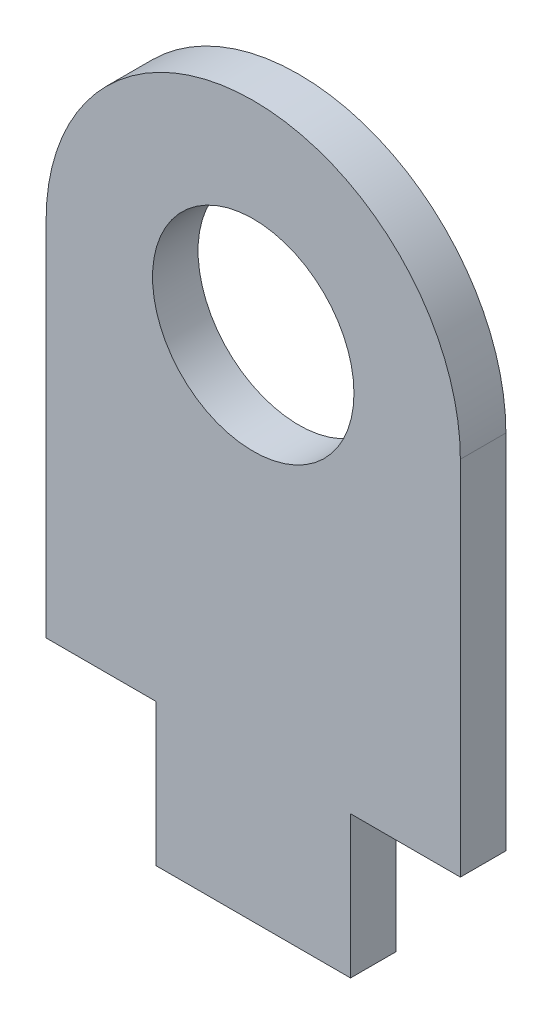
ISO-10303-21;
HEADER;
FILE_DESCRIPTION(('STEP AP214'),'2;1');
FILE_NAME('part.step','',(''),(''),'','','');
FILE_SCHEMA(('AUTOMOTIVE_DESIGN { 1 0 10303 214 1 1 1 1 }'));
ENDSEC;
DATA;
#1=APPLICATION_CONTEXT('core data for automotive mechanical design processes');
#2=APPLICATION_PROTOCOL_DEFINITION('international standard','automotive_design',2000,#1);
#3=PRODUCT_CONTEXT('',#1,'mechanical');
#4=PRODUCT('Part','Part','',(#3));
#5=PRODUCT_RELATED_PRODUCT_CATEGORY('part','',(#4));
#6=PRODUCT_DEFINITION_FORMATION('','',#4);
#7=PRODUCT_DEFINITION_CONTEXT('part definition',#1,'design');
#8=PRODUCT_DEFINITION('design','',#6,#7);
#9=PRODUCT_DEFINITION_SHAPE('','',#8);
#10=(LENGTH_UNIT() NAMED_UNIT(*) SI_UNIT(.MILLI.,.METRE.));
#11=(NAMED_UNIT(*) PLANE_ANGLE_UNIT() SI_UNIT($,.RADIAN.));
#12=(NAMED_UNIT(*) SI_UNIT($,.STERADIAN.) SOLID_ANGLE_UNIT());
#13=UNCERTAINTY_MEASURE_WITH_UNIT(LENGTH_MEASURE(1.E-05),#10,'distance_accuracy_value','');
#14=(GEOMETRIC_REPRESENTATION_CONTEXT(3) GLOBAL_UNCERTAINTY_ASSIGNED_CONTEXT((#13)) GLOBAL_UNIT_ASSIGNED_CONTEXT((#10,
#11,#12)) REPRESENTATION_CONTEXT('',''));
#15=CARTESIAN_POINT('',(0.,0.,0.));
#16=DIRECTION('',(0.,0.,1.));
#17=DIRECTION('',(1.,0.,0.));
#18=AXIS2_PLACEMENT_3D('',#15,#16,#17);
#19=CARTESIAN_POINT('',(0.,1.7272,-0.508));
#20=DIRECTION('',(0.,0.,-1.));
#21=DIRECTION('',(-1.,0.,0.));
#22=AXIS2_PLACEMENT_3D('',#19,#20,#21);
#23=CYLINDRICAL_SURFACE('',#22,4.6228);
#24=DIRECTION('',(0.,0.,-1.));
#25=VECTOR('',#24,1.);
#26=CARTESIAN_POINT('',(4.6228,1.7272,0.508));
#27=LINE('',#26,#25);
#28=CARTESIAN_POINT('',(4.6228,1.7272,-0.508));
#29=VERTEX_POINT('',#28);
#30=CARTESIAN_POINT('',(4.6228,1.7272,0.508));
#31=VERTEX_POINT('',#30);
#32=EDGE_CURVE('E119',#29,#31,#27,.F.);
#33=ORIENTED_EDGE('',*,*,#32,.F.);
#34=CARTESIAN_POINT('',(0.,1.7272,-0.508));
#35=DIRECTION('',(0.,0.,-1.));
#36=DIRECTION('',(-1.,0.,0.));
#37=AXIS2_PLACEMENT_3D('',#34,#35,#36);
#38=CIRCLE('',#37,4.6228);
#39=CARTESIAN_POINT('',(-4.6228,1.7272,-0.508));
#40=VERTEX_POINT('',#39);
#41=EDGE_CURVE('E45',#40,#29,#38,.T.);
#42=ORIENTED_EDGE('',*,*,#41,.F.);
#43=DIRECTION('',(0.,0.,-1.));
#44=VECTOR('',#43,1.);
#45=CARTESIAN_POINT('',(-4.6228,1.7272,0.508));
#46=LINE('',#45,#44);
#47=CARTESIAN_POINT('',(-4.6228,1.7272,0.508));
#48=VERTEX_POINT('',#47);
#49=EDGE_CURVE('E122',#48,#40,#46,.T.);
#50=ORIENTED_EDGE('',*,*,#49,.F.);
#51=CARTESIAN_POINT('',(0.,1.7272,0.508));
#52=DIRECTION('',(0.,0.,-1.));
#53=DIRECTION('',(-1.,0.,0.));
#54=AXIS2_PLACEMENT_3D('',#51,#52,#53);
#55=CIRCLE('',#54,4.6228);
#56=EDGE_CURVE('E11',#31,#48,#55,.F.);
#57=ORIENTED_EDGE('',*,*,#56,.F.);
#58=EDGE_LOOP('',(#33,#42,#50,#57));
#59=FACE_BOUND('',#58,.T.);
#60=ADVANCED_FACE('F37',(#59),#23,.T.);
#61=CARTESIAN_POINT('',(-4.6228,-6.35,0.508));
#62=DIRECTION('',(1.,0.,0.));
#63=DIRECTION('',(0.,0.,-1.));
#64=AXIS2_PLACEMENT_3D('',#61,#62,#63);
#65=PLANE('',#64);
#66=DIRECTION('',(0.,-1.,0.));
#67=VECTOR('',#66,1.);
#68=CARTESIAN_POINT('',(-4.6228,-6.35,0.508));
#69=LINE('',#68,#67);
#70=CARTESIAN_POINT('',(-4.6228,-6.35,0.508));
#71=VERTEX_POINT('',#70);
#72=EDGE_CURVE('E97',#48,#71,#69,.T.);
#73=ORIENTED_EDGE('',*,*,#72,.F.);
#74=ORIENTED_EDGE('',*,*,#49,.T.);
#75=DIRECTION('',(0.,-1.,0.));
#76=VECTOR('',#75,1.);
#77=CARTESIAN_POINT('',(-4.6228,-6.35,-0.508));
#78=LINE('',#77,#76);
#79=CARTESIAN_POINT('',(-4.6228,-6.35,-0.508));
#80=VERTEX_POINT('',#79);
#81=EDGE_CURVE('E117',#40,#80,#78,.T.);
#82=ORIENTED_EDGE('',*,*,#81,.T.);
#83=DIRECTION('',(0.,0.,-1.));
#84=VECTOR('',#83,1.);
#85=CARTESIAN_POINT('',(-4.6228,-6.35,0.508));
#86=LINE('',#85,#84);
#87=EDGE_CURVE('E109',#71,#80,#86,.T.);
#88=ORIENTED_EDGE('',*,*,#87,.F.);
#89=EDGE_LOOP('',(#73,#74,#82,#88));
#90=FACE_BOUND('',#89,.T.);
#91=ADVANCED_FACE('F115',(#90),#65,.F.);
#92=CARTESIAN_POINT('',(-2.1717,-6.35,0.508));
#93=DIRECTION('',(0.,1.,0.));
#94=DIRECTION('',(-1.,0.,0.));
#95=AXIS2_PLACEMENT_3D('',#92,#93,#94);
#96=PLANE('',#95);
#97=DIRECTION('',(1.,0.,0.));
#98=VECTOR('',#97,1.);
#99=CARTESIAN_POINT('',(-2.1717,-6.35,-0.508));
#100=LINE('',#99,#98);
#101=CARTESIAN_POINT('',(-2.1717,-6.35,-0.508));
#102=VERTEX_POINT('',#101);
#103=EDGE_CURVE('E166',#80,#102,#100,.T.);
#104=ORIENTED_EDGE('',*,*,#103,.T.);
#105=DIRECTION('',(0.,0.,-1.));
#106=VECTOR('',#105,1.);
#107=CARTESIAN_POINT('',(-2.1717,-6.35,0.508));
#108=LINE('',#107,#106);
#109=CARTESIAN_POINT('',(-2.1717,-6.35,0.508));
#110=VERTEX_POINT('',#109);
#111=EDGE_CURVE('E111',#110,#102,#108,.T.);
#112=ORIENTED_EDGE('',*,*,#111,.F.);
#113=DIRECTION('',(1.,0.,0.));
#114=VECTOR('',#113,1.);
#115=CARTESIAN_POINT('',(-2.1717,-6.35,0.508));
#116=LINE('',#115,#114);
#117=EDGE_CURVE('E100',#71,#110,#116,.T.);
#118=ORIENTED_EDGE('',*,*,#117,.F.);
#119=ORIENTED_EDGE('',*,*,#87,.T.);
#120=EDGE_LOOP('',(#104,#112,#118,#119));
#121=FACE_BOUND('',#120,.T.);
#122=ADVANCED_FACE('F108',(#121),#96,.F.);
#123=CARTESIAN_POINT('',(-2.1717,-9.525,0.508));
#124=DIRECTION('',(1.,0.,0.));
#125=DIRECTION('',(0.,1.,0.));
#126=AXIS2_PLACEMENT_3D('',#123,#124,#125);
#127=PLANE('',#126);
#128=DIRECTION('',(0.,-1.,0.));
#129=VECTOR('',#128,1.);
#130=CARTESIAN_POINT('',(-2.1717,-9.525,-0.508));
#131=LINE('',#130,#129);
#132=CARTESIAN_POINT('',(-2.1717,-9.525,-0.508));
#133=VERTEX_POINT('',#132);
#134=EDGE_CURVE('E164',#102,#133,#131,.T.);
#135=ORIENTED_EDGE('',*,*,#134,.T.);
#136=DIRECTION('',(0.,0.,-1.));
#137=VECTOR('',#136,1.);
#138=CARTESIAN_POINT('',(-2.1717,-9.525,0.508));
#139=LINE('',#138,#137);
#140=CARTESIAN_POINT('',(-2.1717,-9.525,0.508));
#141=VERTEX_POINT('',#140);
#142=EDGE_CURVE('E124',#141,#133,#139,.T.);
#143=ORIENTED_EDGE('',*,*,#142,.F.);
#144=DIRECTION('',(0.,-1.,0.));
#145=VECTOR('',#144,1.);
#146=CARTESIAN_POINT('',(-2.1717,-9.525,0.508));
#147=LINE('',#146,#145);
#148=EDGE_CURVE('E113',#110,#141,#147,.T.);
#149=ORIENTED_EDGE('',*,*,#148,.F.);
#150=ORIENTED_EDGE('',*,*,#111,.T.);
#151=EDGE_LOOP('',(#135,#143,#149,#150));
#152=FACE_BOUND('',#151,.T.);
#153=ADVANCED_FACE('F208',(#152),#127,.F.);
#154=CARTESIAN_POINT('',(2.1717,-9.525,0.508));
#155=DIRECTION('',(0.,1.,0.));
#156=DIRECTION('',(0.,0.,1.));
#157=AXIS2_PLACEMENT_3D('',#154,#155,#156);
#158=PLANE('',#157);
#159=DIRECTION('',(1.,0.,0.));
#160=VECTOR('',#159,1.);
#161=CARTESIAN_POINT('',(2.1717,-9.525,-0.508));
#162=LINE('',#161,#160);
#163=CARTESIAN_POINT('',(2.1717,-9.525,-0.508));
#164=VERTEX_POINT('',#163);
#165=EDGE_CURVE('E159',#133,#164,#162,.T.);
#166=ORIENTED_EDGE('',*,*,#165,.T.);
#167=DIRECTION('',(0.,0.,-1.));
#168=VECTOR('',#167,1.);
#169=CARTESIAN_POINT('',(2.1717,-9.525,0.508));
#170=LINE('',#169,#168);
#171=CARTESIAN_POINT('',(2.1717,-9.525,0.508));
#172=VERTEX_POINT('',#171);
#173=EDGE_CURVE('E150',#172,#164,#170,.T.);
#174=ORIENTED_EDGE('',*,*,#173,.F.);
#175=DIRECTION('',(1.,0.,0.));
#176=VECTOR('',#175,1.);
#177=CARTESIAN_POINT('',(2.1717,-9.525,0.508));
#178=LINE('',#177,#176);
#179=EDGE_CURVE('E160',#141,#172,#178,.T.);
#180=ORIENTED_EDGE('',*,*,#179,.F.);
#181=ORIENTED_EDGE('',*,*,#142,.T.);
#182=EDGE_LOOP('',(#166,#174,#180,#181));
#183=FACE_BOUND('',#182,.T.);
#184=ADVANCED_FACE('F157',(#183),#158,.F.);
#185=CARTESIAN_POINT('',(2.1717,-6.35,0.508));
#186=DIRECTION('',(-1.,0.,0.));
#187=DIRECTION('',(0.,0.,1.));
#188=AXIS2_PLACEMENT_3D('',#185,#186,#187);
#189=PLANE('',#188);
#190=DIRECTION('',(0.,1.,0.));
#191=VECTOR('',#190,1.);
#192=CARTESIAN_POINT('',(2.1717,-6.35,-0.508));
#193=LINE('',#192,#191);
#194=CARTESIAN_POINT('',(2.1717,-6.35,-0.508));
#195=VERTEX_POINT('',#194);
#196=EDGE_CURVE('E141',#164,#195,#193,.T.);
#197=ORIENTED_EDGE('',*,*,#196,.T.);
#198=DIRECTION('',(0.,0.,-1.));
#199=VECTOR('',#198,1.);
#200=CARTESIAN_POINT('',(2.1717,-6.35,0.508));
#201=LINE('',#200,#199);
#202=CARTESIAN_POINT('',(2.1717,-6.35,0.508));
#203=VERTEX_POINT('',#202);
#204=EDGE_CURVE('E146',#203,#195,#201,.T.);
#205=ORIENTED_EDGE('',*,*,#204,.F.);
#206=DIRECTION('',(0.,1.,0.));
#207=VECTOR('',#206,1.);
#208=CARTESIAN_POINT('',(2.1717,-6.35,0.508));
#209=LINE('',#208,#207);
#210=EDGE_CURVE('E175',#172,#203,#209,.T.);
#211=ORIENTED_EDGE('',*,*,#210,.F.);
#212=ORIENTED_EDGE('',*,*,#173,.T.);
#213=EDGE_LOOP('',(#197,#205,#211,#212));
#214=FACE_BOUND('',#213,.T.);
#215=ADVANCED_FACE('F215',(#214),#189,.F.);
#216=CARTESIAN_POINT('',(4.6228,-6.35,0.508));
#217=DIRECTION('',(0.,1.,0.));
#218=DIRECTION('',(-1.,0.,0.));
#219=AXIS2_PLACEMENT_3D('',#216,#217,#218);
#220=PLANE('',#219);
#221=DIRECTION('',(1.,0.,0.));
#222=VECTOR('',#221,1.);
#223=CARTESIAN_POINT('',(4.6228,-6.35,-0.508));
#224=LINE('',#223,#222);
#225=CARTESIAN_POINT('',(4.6228,-6.35,-0.508));
#226=VERTEX_POINT('',#225);
#227=EDGE_CURVE('E139',#195,#226,#224,.T.);
#228=ORIENTED_EDGE('',*,*,#227,.T.);
#229=DIRECTION('',(0.,0.,-1.));
#230=VECTOR('',#229,1.);
#231=CARTESIAN_POINT('',(4.6228,-6.35,0.508));
#232=LINE('',#231,#230);
#233=CARTESIAN_POINT('',(4.6228,-6.35,0.508));
#234=VERTEX_POINT('',#233);
#235=EDGE_CURVE('E138',#234,#226,#232,.T.);
#236=ORIENTED_EDGE('',*,*,#235,.F.);
#237=DIRECTION('',(1.,0.,0.));
#238=VECTOR('',#237,1.);
#239=CARTESIAN_POINT('',(4.6228,-6.35,0.508));
#240=LINE('',#239,#238);
#241=EDGE_CURVE('E173',#203,#234,#240,.T.);
#242=ORIENTED_EDGE('',*,*,#241,.F.);
#243=ORIENTED_EDGE('',*,*,#204,.T.);
#244=EDGE_LOOP('',(#228,#236,#242,#243));
#245=FACE_BOUND('',#244,.T.);
#246=ADVANCED_FACE('F199',(#245),#220,.F.);
#247=CARTESIAN_POINT('',(4.6228,6.35,0.508));
#248=DIRECTION('',(-1.,0.,0.));
#249=DIRECTION('',(0.,0.,1.));
#250=AXIS2_PLACEMENT_3D('',#247,#248,#249);
#251=PLANE('',#250);
#252=DIRECTION('',(0.,1.,0.));
#253=VECTOR('',#252,1.);
#254=CARTESIAN_POINT('',(4.6228,6.35,-0.508));
#255=LINE('',#254,#253);
#256=EDGE_CURVE('E104',#226,#29,#255,.T.);
#257=ORIENTED_EDGE('',*,*,#256,.T.);
#258=ORIENTED_EDGE('',*,*,#32,.T.);
#259=DIRECTION('',(0.,1.,0.));
#260=VECTOR('',#259,1.);
#261=CARTESIAN_POINT('',(4.6228,6.35,0.508));
#262=LINE('',#261,#260);
#263=EDGE_CURVE('E147',#234,#31,#262,.T.);
#264=ORIENTED_EDGE('',*,*,#263,.F.);
#265=ORIENTED_EDGE('',*,*,#235,.T.);
#266=EDGE_LOOP('',(#257,#258,#264,#265));
#267=FACE_BOUND('',#266,.T.);
#268=ADVANCED_FACE('F136',(#267),#251,.F.);
#269=CARTESIAN_POINT('',(0.,0.,0.508));
#270=DIRECTION('',(0.,0.,-1.));
#271=DIRECTION('',(-1.,0.,0.));
#272=AXIS2_PLACEMENT_3D('',#269,#270,#271);
#273=PLANE('',#272);
#274=CARTESIAN_POINT('',(0.,1.8161,0.508));
#275=DIRECTION('',(0.,0.,1.));
#276=DIRECTION('',(1.,0.,0.));
#277=AXIS2_PLACEMENT_3D('',#274,#275,#276);
#278=CIRCLE('',#277,2.2479);
#279=CARTESIAN_POINT('',(2.2479,1.8161,0.508));
#280=VERTEX_POINT('',#279);
#281=EDGE_CURVE('E179',#280,#280,#278,.T.);
#282=ORIENTED_EDGE('',*,*,#281,.F.);
#283=EDGE_LOOP('',(#282));
#284=FACE_BOUND('',#283,.T.);
#285=ORIENTED_EDGE('',*,*,#263,.T.);
#286=ORIENTED_EDGE('',*,*,#56,.T.);
#287=ORIENTED_EDGE('',*,*,#72,.T.);
#288=ORIENTED_EDGE('',*,*,#117,.T.);
#289=ORIENTED_EDGE('',*,*,#148,.T.);
#290=ORIENTED_EDGE('',*,*,#179,.T.);
#291=ORIENTED_EDGE('',*,*,#210,.T.);
#292=ORIENTED_EDGE('',*,*,#241,.T.);
#293=EDGE_LOOP('',(#285,#286,#287,#288,#289,#290,#291,#292));
#294=FACE_BOUND('',#293,.T.);
#295=ADVANCED_FACE('F99',(#284,#294),#273,.F.);
#296=CARTESIAN_POINT('',(0.,0.,-0.508));
#297=DIRECTION('',(0.,0.,-1.));
#298=DIRECTION('',(-1.,0.,0.));
#299=AXIS2_PLACEMENT_3D('',#296,#297,#298);
#300=PLANE('',#299);
#301=CARTESIAN_POINT('',(0.,1.8161,-0.508));
#302=DIRECTION('',(0.,0.,1.));
#303=DIRECTION('',(1.,0.,0.));
#304=AXIS2_PLACEMENT_3D('',#301,#302,#303);
#305=CIRCLE('',#304,2.2479);
#306=CARTESIAN_POINT('',(2.2479,1.8161,-0.508));
#307=VERTEX_POINT('',#306);
#308=EDGE_CURVE('E171',#307,#307,#305,.T.);
#309=ORIENTED_EDGE('',*,*,#308,.T.);
#310=EDGE_LOOP('',(#309));
#311=FACE_BOUND('',#310,.T.);
#312=ORIENTED_EDGE('',*,*,#81,.F.);
#313=ORIENTED_EDGE('',*,*,#41,.T.);
#314=ORIENTED_EDGE('',*,*,#256,.F.);
#315=ORIENTED_EDGE('',*,*,#227,.F.);
#316=ORIENTED_EDGE('',*,*,#196,.F.);
#317=ORIENTED_EDGE('',*,*,#165,.F.);
#318=ORIENTED_EDGE('',*,*,#134,.F.);
#319=ORIENTED_EDGE('',*,*,#103,.F.);
#320=EDGE_LOOP('',(#312,#313,#314,#315,#316,#317,#318,#319));
#321=FACE_BOUND('',#320,.T.);
#322=ADVANCED_FACE('F130',(#311,#321),#300,.T.);
#323=CARTESIAN_POINT('',(0.,1.8161,-0.508));
#324=DIRECTION('',(0.,0.,1.));
#325=DIRECTION('',(1.,0.,0.));
#326=AXIS2_PLACEMENT_3D('',#323,#324,#325);
#327=CYLINDRICAL_SURFACE('',#326,2.2479);
#328=ORIENTED_EDGE('',*,*,#308,.F.);
#329=EDGE_LOOP('',(#328));
#330=FACE_BOUND('',#329,.T.);
#331=ORIENTED_EDGE('',*,*,#281,.T.);
#332=EDGE_LOOP('',(#331));
#333=FACE_BOUND('',#332,.T.);
#334=ADVANCED_FACE('F186',(#330,#333),#327,.F.);
#335=CLOSED_SHELL('',(#60,#91,#122,#153,#184,#215,#246,#268,#295,#322,#334));
#336=MANIFOLD_SOLID_BREP('B2',#335);
#337=ADVANCED_BREP_SHAPE_REPRESENTATION('',(#18,#336),#14);
#338=SHAPE_DEFINITION_REPRESENTATION(#9,#337);
ENDSEC;
END-ISO-10303-21;
